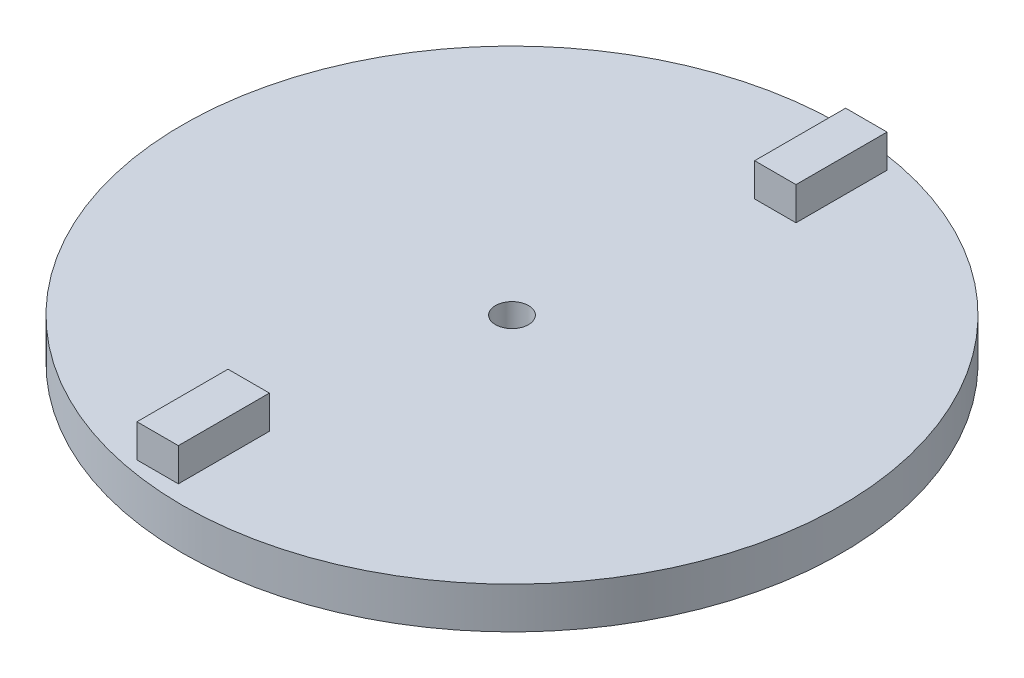
ISO-10303-21;
HEADER;
FILE_DESCRIPTION(('STEP AP214'),'2;1');
FILE_NAME('part.step','',(''),(''),'','','');
FILE_SCHEMA(('AUTOMOTIVE_DESIGN { 1 0 10303 214 1 1 1 1 }'));
ENDSEC;
DATA;
#1=APPLICATION_CONTEXT('core data for automotive mechanical design processes');
#2=APPLICATION_PROTOCOL_DEFINITION('international standard','automotive_design',2000,#1);
#3=PRODUCT_CONTEXT('',#1,'mechanical');
#4=PRODUCT('Part','Part','',(#3));
#5=PRODUCT_RELATED_PRODUCT_CATEGORY('part','',(#4));
#6=PRODUCT_DEFINITION_FORMATION('','',#4);
#7=PRODUCT_DEFINITION_CONTEXT('part definition',#1,'design');
#8=PRODUCT_DEFINITION('design','',#6,#7);
#9=PRODUCT_DEFINITION_SHAPE('','',#8);
#10=(LENGTH_UNIT() NAMED_UNIT(*) SI_UNIT(.MILLI.,.METRE.));
#11=(NAMED_UNIT(*) PLANE_ANGLE_UNIT() SI_UNIT($,.RADIAN.));
#12=(NAMED_UNIT(*) SI_UNIT($,.STERADIAN.) SOLID_ANGLE_UNIT());
#13=UNCERTAINTY_MEASURE_WITH_UNIT(LENGTH_MEASURE(1.E-05),#10,'distance_accuracy_value','');
#14=(GEOMETRIC_REPRESENTATION_CONTEXT(3) GLOBAL_UNCERTAINTY_ASSIGNED_CONTEXT((#13)) GLOBAL_UNIT_ASSIGNED_CONTEXT((#10,
#11,#12)) REPRESENTATION_CONTEXT('',''));
#15=CARTESIAN_POINT('',(0.,0.,0.));
#16=DIRECTION('',(0.,0.,1.));
#17=DIRECTION('',(1.,0.,0.));
#18=AXIS2_PLACEMENT_3D('',#15,#16,#17);
#19=CARTESIAN_POINT('',(9.525,0.,-48.028352));
#20=DIRECTION('',(0.,0.,1.));
#21=DIRECTION('',(1.,0.,0.));
#22=AXIS2_PLACEMENT_3D('',#19,#20,#21);
#23=PLANE('',#22);
#24=DIRECTION('',(0.,-1.,0.));
#25=VECTOR('',#24,1.);
#26=CARTESIAN_POINT('',(3.175,11.43,-48.028352));
#27=LINE('',#26,#25);
#28=CARTESIAN_POINT('',(3.175,11.43,-48.028352));
#29=VERTEX_POINT('',#28);
#30=CARTESIAN_POINT('',(3.175,6.35,-48.028352));
#31=VERTEX_POINT('',#30);
#32=EDGE_CURVE('E111',#29,#31,#27,.T.);
#33=ORIENTED_EDGE('',*,*,#32,.F.);
#34=DIRECTION('',(-1.,0.,0.));
#35=VECTOR('',#34,1.);
#36=CARTESIAN_POINT('',(9.525,11.43,-48.028352));
#37=LINE('',#36,#35);
#38=CARTESIAN_POINT('',(9.525,11.43,-48.028352));
#39=VERTEX_POINT('',#38);
#40=EDGE_CURVE('E136',#39,#29,#37,.T.);
#41=ORIENTED_EDGE('',*,*,#40,.F.);
#42=DIRECTION('',(0.,1.,0.));
#43=VECTOR('',#42,1.);
#44=CARTESIAN_POINT('',(9.525,0.,-48.028352));
#45=LINE('',#44,#43);
#46=CARTESIAN_POINT('',(9.525,6.35,-48.028352));
#47=VERTEX_POINT('',#46);
#48=EDGE_CURVE('E122',#47,#39,#45,.T.);
#49=ORIENTED_EDGE('',*,*,#48,.F.);
#50=DIRECTION('',(-1.,0.,0.));
#51=VECTOR('',#50,1.);
#52=CARTESIAN_POINT('',(9.525,6.35,-48.028352));
#53=LINE('',#52,#51);
#54=EDGE_CURVE('E58',#47,#31,#53,.T.);
#55=ORIENTED_EDGE('',*,*,#54,.T.);
#56=EDGE_LOOP('',(#33,#41,#49,#55));
#57=FACE_BOUND('',#56,.T.);
#58=ADVANCED_FACE('F43',(#57),#23,.F.);
#59=CARTESIAN_POINT('',(9.525,11.43,0.));
#60=DIRECTION('',(0.,1.,0.));
#61=DIRECTION('',(0.,0.,1.));
#62=AXIS2_PLACEMENT_3D('',#59,#60,#61);
#63=PLANE('',#62);
#64=ORIENTED_EDGE('',*,*,#40,.T.);
#65=DIRECTION('',(0.,0.,-1.));
#66=VECTOR('',#65,1.);
#67=CARTESIAN_POINT('',(3.175,11.43,-48.028352));
#68=LINE('',#67,#66);
#69=CARTESIAN_POINT('',(3.175,11.43,-34.058352));
#70=VERTEX_POINT('',#69);
#71=EDGE_CURVE('E116',#70,#29,#68,.T.);
#72=ORIENTED_EDGE('',*,*,#71,.F.);
#73=DIRECTION('',(-1.,0.,0.));
#74=VECTOR('',#73,1.);
#75=CARTESIAN_POINT('',(9.525,11.43,-34.058352));
#76=LINE('',#75,#74);
#77=CARTESIAN_POINT('',(9.525,11.43,-34.058352));
#78=VERTEX_POINT('',#77);
#79=EDGE_CURVE('E125',#78,#70,#76,.T.);
#80=ORIENTED_EDGE('',*,*,#79,.F.);
#81=DIRECTION('',(0.,0.,-1.));
#82=VECTOR('',#81,1.);
#83=CARTESIAN_POINT('',(9.525,11.43,0.));
#84=LINE('',#83,#82);
#85=EDGE_CURVE('E123',#78,#39,#84,.T.);
#86=ORIENTED_EDGE('',*,*,#85,.T.);
#87=EDGE_LOOP('',(#64,#72,#80,#86));
#88=FACE_BOUND('',#87,.T.);
#89=ADVANCED_FACE('F189',(#88),#63,.T.);
#90=CARTESIAN_POINT('',(9.525,0.,-34.058352));
#91=DIRECTION('',(0.,0.,1.));
#92=DIRECTION('',(1.,0.,0.));
#93=AXIS2_PLACEMENT_3D('',#90,#91,#92);
#94=PLANE('',#93);
#95=ORIENTED_EDGE('',*,*,#79,.T.);
#96=DIRECTION('',(0.,1.,0.));
#97=VECTOR('',#96,1.);
#98=CARTESIAN_POINT('',(3.175,11.43,-34.058352));
#99=LINE('',#98,#97);
#100=CARTESIAN_POINT('',(3.175,6.35,-34.058352));
#101=VERTEX_POINT('',#100);
#102=EDGE_CURVE('E110',#101,#70,#99,.T.);
#103=ORIENTED_EDGE('',*,*,#102,.F.);
#104=DIRECTION('',(-1.,0.,0.));
#105=VECTOR('',#104,1.);
#106=CARTESIAN_POINT('',(9.525,6.35,-34.058352));
#107=LINE('',#106,#105);
#108=CARTESIAN_POINT('',(9.525,6.35,-34.058352));
#109=VERTEX_POINT('',#108);
#110=EDGE_CURVE('E107',#109,#101,#107,.T.);
#111=ORIENTED_EDGE('',*,*,#110,.F.);
#112=DIRECTION('',(0.,1.,0.));
#113=VECTOR('',#112,1.);
#114=CARTESIAN_POINT('',(9.525,0.,-34.058352));
#115=LINE('',#114,#113);
#116=EDGE_CURVE('E128',#109,#78,#115,.T.);
#117=ORIENTED_EDGE('',*,*,#116,.T.);
#118=EDGE_LOOP('',(#95,#103,#111,#117));
#119=FACE_BOUND('',#118,.T.);
#120=ADVANCED_FACE('F194',(#119),#94,.T.);
#121=CARTESIAN_POINT('',(0.,6.35,0.));
#122=DIRECTION('',(0.,1.,0.));
#123=DIRECTION('',(0.,0.,1.));
#124=AXIS2_PLACEMENT_3D('',#121,#122,#123);
#125=PLANE('',#124);
#126=CARTESIAN_POINT('',(0.,6.35,0.));
#127=DIRECTION('',(0.,1.,0.));
#128=DIRECTION('',(0.,0.,1.));
#129=AXIS2_PLACEMENT_3D('',#126,#127,#128);
#130=CIRCLE('',#129,50.5757923262299);
#131=CARTESIAN_POINT('',(0.,6.35,50.5757923262299));
#132=VERTEX_POINT('',#131);
#133=EDGE_CURVE('E11',#132,#132,#130,.T.);
#134=ORIENTED_EDGE('',*,*,#133,.T.);
#135=EDGE_LOOP('',(#134));
#136=FACE_BOUND('',#135,.T.);
#137=CARTESIAN_POINT('',(0.,6.35,0.));
#138=DIRECTION('',(0.,1.,0.));
#139=DIRECTION('',(0.,0.,1.));
#140=AXIS2_PLACEMENT_3D('',#137,#138,#139);
#141=CIRCLE('',#140,2.54);
#142=CARTESIAN_POINT('',(0.,6.35,2.54));
#143=VERTEX_POINT('',#142);
#144=EDGE_CURVE('E166',#143,#143,#141,.T.);
#145=ORIENTED_EDGE('',*,*,#144,.F.);
#146=EDGE_LOOP('',(#145));
#147=FACE_BOUND('',#146,.T.);
#148=DIRECTION('',(1.,0.,0.));
#149=VECTOR('',#148,1.);
#150=CARTESIAN_POINT('',(-9.525,6.35,48.028352));
#151=LINE('',#150,#149);
#152=CARTESIAN_POINT('',(-9.525,6.35,48.028352));
#153=VERTEX_POINT('',#152);
#154=CARTESIAN_POINT('',(-3.175,6.35,48.028352));
#155=VERTEX_POINT('',#154);
#156=EDGE_CURVE('E153',#153,#155,#151,.T.);
#157=ORIENTED_EDGE('',*,*,#156,.F.);
#158=DIRECTION('',(0.,0.,1.));
#159=VECTOR('',#158,1.);
#160=CARTESIAN_POINT('',(-9.525,6.35000000000001,0.));
#161=LINE('',#160,#159);
#162=CARTESIAN_POINT('',(-9.525,6.35,34.058352));
#163=VERTEX_POINT('',#162);
#164=EDGE_CURVE('E144',#163,#153,#161,.T.);
#165=ORIENTED_EDGE('',*,*,#164,.F.);
#166=DIRECTION('',(1.,0.,0.));
#167=VECTOR('',#166,1.);
#168=CARTESIAN_POINT('',(-9.525,6.35,34.058352));
#169=LINE('',#168,#167);
#170=CARTESIAN_POINT('',(-3.175,6.35,34.058352));
#171=VERTEX_POINT('',#170);
#172=EDGE_CURVE('E161',#163,#171,#169,.T.);
#173=ORIENTED_EDGE('',*,*,#172,.T.);
#174=DIRECTION('',(0.,0.,-1.));
#175=VECTOR('',#174,1.);
#176=CARTESIAN_POINT('',(-3.175,6.35,48.028352));
#177=LINE('',#176,#175);
#178=EDGE_CURVE('E135',#155,#171,#177,.T.);
#179=ORIENTED_EDGE('',*,*,#178,.F.);
#180=EDGE_LOOP('',(#157,#165,#173,#179));
#181=FACE_BOUND('',#180,.T.);
#182=ORIENTED_EDGE('',*,*,#54,.F.);
#183=DIRECTION('',(0.,0.,-1.));
#184=VECTOR('',#183,1.);
#185=CARTESIAN_POINT('',(9.525,6.35000000000001,0.));
#186=LINE('',#185,#184);
#187=EDGE_CURVE('E62',#109,#47,#186,.T.);
#188=ORIENTED_EDGE('',*,*,#187,.F.);
#189=ORIENTED_EDGE('',*,*,#110,.T.);
#190=DIRECTION('',(0.,0.,1.));
#191=VECTOR('',#190,1.);
#192=CARTESIAN_POINT('',(3.175,6.35,-48.028352));
#193=LINE('',#192,#191);
#194=EDGE_CURVE('E104',#31,#101,#193,.T.);
#195=ORIENTED_EDGE('',*,*,#194,.F.);
#196=EDGE_LOOP('',(#182,#188,#189,#195));
#197=FACE_BOUND('',#196,.T.);
#198=ADVANCED_FACE('F106',(#136,#147,#181,#197),#125,.T.);
#199=CARTESIAN_POINT('',(0.,0.,0.));
#200=DIRECTION('',(0.,1.,0.));
#201=DIRECTION('',(0.,0.,1.));
#202=AXIS2_PLACEMENT_3D('',#199,#200,#201);
#203=PLANE('',#202);
#204=CARTESIAN_POINT('',(0.,0.,0.));
#205=DIRECTION('',(0.,1.,0.));
#206=DIRECTION('',(0.,0.,1.));
#207=AXIS2_PLACEMENT_3D('',#204,#205,#206);
#208=CIRCLE('',#207,50.5757923262299);
#209=CARTESIAN_POINT('',(0.,0.,50.5757923262299));
#210=VERTEX_POINT('',#209);
#211=EDGE_CURVE('E47',#210,#210,#208,.T.);
#212=ORIENTED_EDGE('',*,*,#211,.F.);
#213=EDGE_LOOP('',(#212));
#214=FACE_BOUND('',#213,.T.);
#215=CARTESIAN_POINT('',(0.,0.,0.));
#216=DIRECTION('',(0.,1.,0.));
#217=DIRECTION('',(0.,0.,1.));
#218=AXIS2_PLACEMENT_3D('',#215,#216,#217);
#219=CIRCLE('',#218,2.54);
#220=CARTESIAN_POINT('',(0.,0.,2.54));
#221=VERTEX_POINT('',#220);
#222=EDGE_CURVE('E157',#221,#221,#219,.T.);
#223=ORIENTED_EDGE('',*,*,#222,.T.);
#224=EDGE_LOOP('',(#223));
#225=FACE_BOUND('',#224,.T.);
#226=ADVANCED_FACE('F172',(#214,#225),#203,.F.);
#227=CARTESIAN_POINT('',(0.,6.35,0.));
#228=DIRECTION('',(0.,-1.,0.));
#229=DIRECTION('',(0.,0.,-1.));
#230=AXIS2_PLACEMENT_3D('',#227,#228,#229);
#231=CYLINDRICAL_SURFACE('',#230,50.5757923262299);
#232=ORIENTED_EDGE('',*,*,#133,.F.);
#233=EDGE_LOOP('',(#232));
#234=FACE_BOUND('',#233,.T.);
#235=ORIENTED_EDGE('',*,*,#211,.T.);
#236=EDGE_LOOP('',(#235));
#237=FACE_BOUND('',#236,.T.);
#238=ADVANCED_FACE('F45',(#234,#237),#231,.T.);
#239=CARTESIAN_POINT('',(0.,6.35,0.));
#240=DIRECTION('',(0.,-1.,0.));
#241=DIRECTION('',(0.,0.,-1.));
#242=AXIS2_PLACEMENT_3D('',#239,#240,#241);
#243=CYLINDRICAL_SURFACE('',#242,2.54);
#244=ORIENTED_EDGE('',*,*,#144,.T.);
#245=EDGE_LOOP('',(#244));
#246=FACE_BOUND('',#245,.T.);
#247=ORIENTED_EDGE('',*,*,#222,.F.);
#248=EDGE_LOOP('',(#247));
#249=FACE_BOUND('',#248,.T.);
#250=ADVANCED_FACE('F174',(#246,#249),#243,.F.);
#251=CARTESIAN_POINT('',(-9.525,0.,48.028352));
#252=DIRECTION('',(0.,0.,-1.));
#253=DIRECTION('',(-1.,0.,0.));
#254=AXIS2_PLACEMENT_3D('',#251,#252,#253);
#255=PLANE('',#254);
#256=ORIENTED_EDGE('',*,*,#156,.T.);
#257=DIRECTION('',(0.,-1.,0.));
#258=VECTOR('',#257,1.);
#259=CARTESIAN_POINT('',(-3.175,6.35,48.028352));
#260=LINE('',#259,#258);
#261=CARTESIAN_POINT('',(-3.175,11.43,48.028352));
#262=VERTEX_POINT('',#261);
#263=EDGE_CURVE('E132',#262,#155,#260,.T.);
#264=ORIENTED_EDGE('',*,*,#263,.F.);
#265=DIRECTION('',(1.,0.,0.));
#266=VECTOR('',#265,1.);
#267=CARTESIAN_POINT('',(-9.525,11.43,48.028352));
#268=LINE('',#267,#266);
#269=CARTESIAN_POINT('',(-9.525,11.43,48.028352));
#270=VERTEX_POINT('',#269);
#271=EDGE_CURVE('E154',#270,#262,#268,.T.);
#272=ORIENTED_EDGE('',*,*,#271,.F.);
#273=DIRECTION('',(0.,1.,0.));
#274=VECTOR('',#273,1.);
#275=CARTESIAN_POINT('',(-9.525,0.,48.028352));
#276=LINE('',#275,#274);
#277=EDGE_CURVE('E142',#153,#270,#276,.T.);
#278=ORIENTED_EDGE('',*,*,#277,.F.);
#279=EDGE_LOOP('',(#256,#264,#272,#278));
#280=FACE_BOUND('',#279,.T.);
#281=ADVANCED_FACE('F176',(#280),#255,.F.);
#282=CARTESIAN_POINT('',(-9.525,11.43,0.));
#283=DIRECTION('',(0.,1.,0.));
#284=DIRECTION('',(0.,0.,1.));
#285=AXIS2_PLACEMENT_3D('',#282,#283,#284);
#286=PLANE('',#285);
#287=DIRECTION('',(0.,0.,1.));
#288=VECTOR('',#287,1.);
#289=CARTESIAN_POINT('',(-3.175,11.43,48.028352));
#290=LINE('',#289,#288);
#291=CARTESIAN_POINT('',(-3.175,11.43,34.058352));
#292=VERTEX_POINT('',#291);
#293=EDGE_CURVE('E140',#292,#262,#290,.T.);
#294=ORIENTED_EDGE('',*,*,#293,.F.);
#295=DIRECTION('',(1.,0.,0.));
#296=VECTOR('',#295,1.);
#297=CARTESIAN_POINT('',(-9.525,11.43,34.058352));
#298=LINE('',#297,#296);
#299=CARTESIAN_POINT('',(-9.525,11.43,34.058352));
#300=VERTEX_POINT('',#299);
#301=EDGE_CURVE('E158',#300,#292,#298,.T.);
#302=ORIENTED_EDGE('',*,*,#301,.F.);
#303=DIRECTION('',(0.,0.,1.));
#304=VECTOR('',#303,1.);
#305=CARTESIAN_POINT('',(-9.525,11.43,0.));
#306=LINE('',#305,#304);
#307=EDGE_CURVE('E150',#300,#270,#306,.T.);
#308=ORIENTED_EDGE('',*,*,#307,.T.);
#309=ORIENTED_EDGE('',*,*,#271,.T.);
#310=EDGE_LOOP('',(#294,#302,#308,#309));
#311=FACE_BOUND('',#310,.T.);
#312=ADVANCED_FACE('F183',(#311),#286,.T.);
#313=CARTESIAN_POINT('',(-9.525,0.,34.058352));
#314=DIRECTION('',(0.,0.,-1.));
#315=DIRECTION('',(-1.,0.,0.));
#316=AXIS2_PLACEMENT_3D('',#313,#314,#315);
#317=PLANE('',#316);
#318=DIRECTION('',(0.,1.,0.));
#319=VECTOR('',#318,1.);
#320=CARTESIAN_POINT('',(-3.175,6.35,34.058352));
#321=LINE('',#320,#319);
#322=EDGE_CURVE('E138',#171,#292,#321,.T.);
#323=ORIENTED_EDGE('',*,*,#322,.F.);
#324=ORIENTED_EDGE('',*,*,#172,.F.);
#325=DIRECTION('',(0.,1.,0.));
#326=VECTOR('',#325,1.);
#327=CARTESIAN_POINT('',(-9.525,0.,34.058352));
#328=LINE('',#327,#326);
#329=EDGE_CURVE('E147',#163,#300,#328,.T.);
#330=ORIENTED_EDGE('',*,*,#329,.T.);
#331=ORIENTED_EDGE('',*,*,#301,.T.);
#332=EDGE_LOOP('',(#323,#324,#330,#331));
#333=FACE_BOUND('',#332,.T.);
#334=ADVANCED_FACE('F207',(#333),#317,.T.);
#335=CARTESIAN_POINT('',(-9.525,0.,0.));
#336=DIRECTION('',(1.,0.,0.));
#337=DIRECTION('',(0.,0.,-1.));
#338=AXIS2_PLACEMENT_3D('',#335,#336,#337);
#339=PLANE('',#338);
#340=ORIENTED_EDGE('',*,*,#277,.T.);
#341=ORIENTED_EDGE('',*,*,#307,.F.);
#342=ORIENTED_EDGE('',*,*,#329,.F.);
#343=ORIENTED_EDGE('',*,*,#164,.T.);
#344=EDGE_LOOP('',(#340,#341,#342,#343));
#345=FACE_BOUND('',#344,.T.);
#346=ADVANCED_FACE('F203',(#345),#339,.F.);
#347=CARTESIAN_POINT('',(-3.175,0.,0.));
#348=DIRECTION('',(-1.,0.,0.));
#349=DIRECTION('',(0.,0.,1.));
#350=AXIS2_PLACEMENT_3D('',#347,#348,#349);
#351=PLANE('',#350);
#352=ORIENTED_EDGE('',*,*,#263,.T.);
#353=ORIENTED_EDGE('',*,*,#178,.T.);
#354=ORIENTED_EDGE('',*,*,#322,.T.);
#355=ORIENTED_EDGE('',*,*,#293,.T.);
#356=EDGE_LOOP('',(#352,#353,#354,#355));
#357=FACE_BOUND('',#356,.T.);
#358=ADVANCED_FACE('F199',(#357),#351,.F.);
#359=CARTESIAN_POINT('',(9.525,0.,0.));
#360=DIRECTION('',(-1.,0.,0.));
#361=DIRECTION('',(0.,0.,1.));
#362=AXIS2_PLACEMENT_3D('',#359,#360,#361);
#363=PLANE('',#362);
#364=ORIENTED_EDGE('',*,*,#48,.T.);
#365=ORIENTED_EDGE('',*,*,#85,.F.);
#366=ORIENTED_EDGE('',*,*,#116,.F.);
#367=ORIENTED_EDGE('',*,*,#187,.T.);
#368=EDGE_LOOP('',(#364,#365,#366,#367));
#369=FACE_BOUND('',#368,.T.);
#370=ADVANCED_FACE('F202',(#369),#363,.F.);
#371=CARTESIAN_POINT('',(3.175,0.,0.));
#372=DIRECTION('',(-1.,0.,0.));
#373=DIRECTION('',(0.,0.,1.));
#374=AXIS2_PLACEMENT_3D('',#371,#372,#373);
#375=PLANE('',#374);
#376=ORIENTED_EDGE('',*,*,#32,.T.);
#377=ORIENTED_EDGE('',*,*,#194,.T.);
#378=ORIENTED_EDGE('',*,*,#102,.T.);
#379=ORIENTED_EDGE('',*,*,#71,.T.);
#380=EDGE_LOOP('',(#376,#377,#378,#379));
#381=FACE_BOUND('',#380,.T.);
#382=ADVANCED_FACE('F114',(#381),#375,.T.);
#383=CLOSED_SHELL('',(#58,#89,#120,#198,#226,#238,#250,#281,#312,#334,#346,#358,#370,#382));
#384=MANIFOLD_SOLID_BREP('B2',#383);
#385=ADVANCED_BREP_SHAPE_REPRESENTATION('',(#18,#384),#14);
#386=SHAPE_DEFINITION_REPRESENTATION(#9,#385);
ENDSEC;
END-ISO-10303-21;
